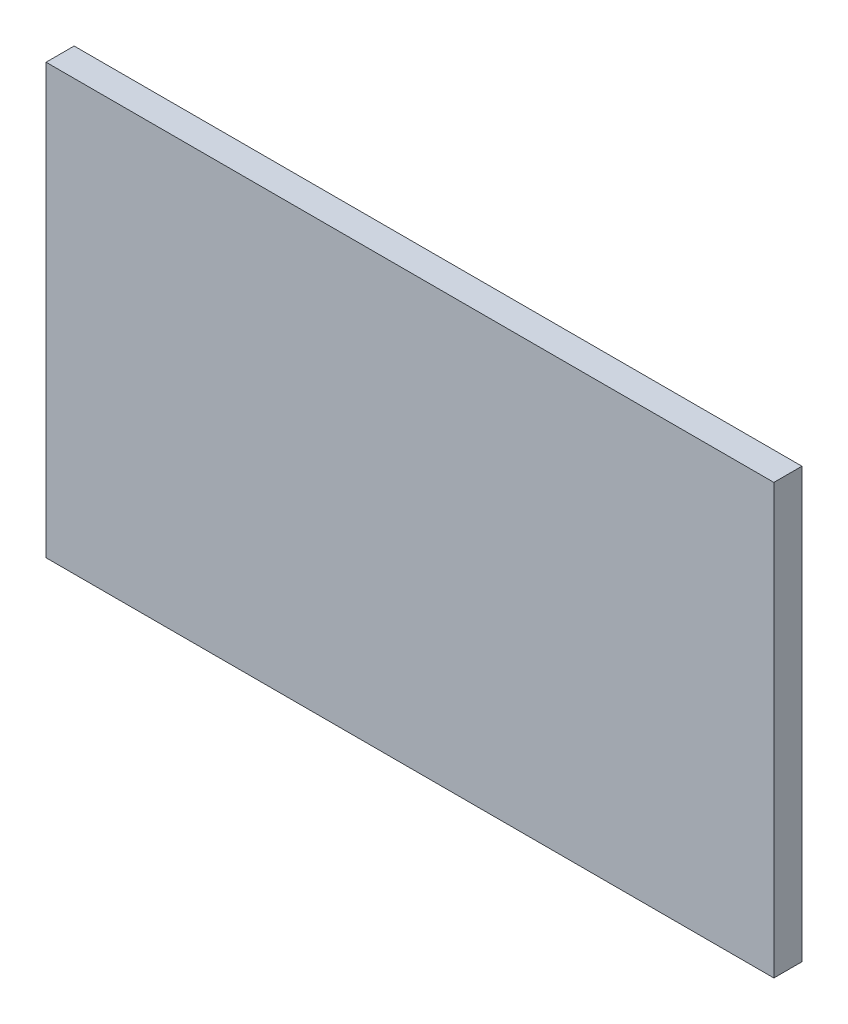
ISO-10303-21;
HEADER;
FILE_DESCRIPTION(('STEP AP214'),'2;1');
FILE_NAME('part.step','',(''),(''),'','','');
FILE_SCHEMA(('AUTOMOTIVE_DESIGN { 1 0 10303 214 1 1 1 1 }'));
ENDSEC;
DATA;
#1=APPLICATION_CONTEXT('core data for automotive mechanical design processes');
#2=APPLICATION_PROTOCOL_DEFINITION('international standard','automotive_design',2000,#1);
#3=PRODUCT_CONTEXT('',#1,'mechanical');
#4=PRODUCT('Part','Part','',(#3));
#5=PRODUCT_RELATED_PRODUCT_CATEGORY('part','',(#4));
#6=PRODUCT_DEFINITION_FORMATION('','',#4);
#7=PRODUCT_DEFINITION_CONTEXT('part definition',#1,'design');
#8=PRODUCT_DEFINITION('design','',#6,#7);
#9=PRODUCT_DEFINITION_SHAPE('','',#8);
#10=(LENGTH_UNIT() NAMED_UNIT(*) SI_UNIT(.MILLI.,.METRE.));
#11=(NAMED_UNIT(*) PLANE_ANGLE_UNIT() SI_UNIT($,.RADIAN.));
#12=(NAMED_UNIT(*) SI_UNIT($,.STERADIAN.) SOLID_ANGLE_UNIT());
#13=UNCERTAINTY_MEASURE_WITH_UNIT(LENGTH_MEASURE(1.E-05),#10,'distance_accuracy_value','');
#14=(GEOMETRIC_REPRESENTATION_CONTEXT(3) GLOBAL_UNCERTAINTY_ASSIGNED_CONTEXT((#13)) GLOBAL_UNIT_ASSIGNED_CONTEXT((#10,
#11,#12)) REPRESENTATION_CONTEXT('',''));
#15=CARTESIAN_POINT('',(0.,0.,0.));
#16=DIRECTION('',(0.,0.,1.));
#17=DIRECTION('',(1.,0.,0.));
#18=AXIS2_PLACEMENT_3D('',#15,#16,#17);
#19=CARTESIAN_POINT('',(17.145,31.115,2.16));
#20=DIRECTION('',(0.,0.,-1.));
#21=DIRECTION('',(-1.,0.,0.));
#22=AXIS2_PLACEMENT_3D('',#19,#20,#21);
#23=PLANE('',#22);
#24=DIRECTION('',(0.,1.,0.));
#25=VECTOR('',#24,1.);
#26=CARTESIAN_POINT('',(-32.385,31.115,2.16));
#27=LINE('',#26,#25);
#28=CARTESIAN_POINT('',(-32.385,31.115,2.16));
#29=VERTEX_POINT('',#28);
#30=CARTESIAN_POINT('',(-32.385,1.905,2.16));
#31=VERTEX_POINT('',#30);
#32=EDGE_CURVE('E55',#29,#31,#27,.F.);
#33=ORIENTED_EDGE('',*,*,#32,.T.);
#34=DIRECTION('',(1.,0.,0.));
#35=VECTOR('',#34,1.);
#36=CARTESIAN_POINT('',(-32.385,1.905,2.16));
#37=LINE('',#36,#35);
#38=CARTESIAN_POINT('',(17.145,1.905,2.16));
#39=VERTEX_POINT('',#38);
#40=EDGE_CURVE('E57',#31,#39,#37,.T.);
#41=ORIENTED_EDGE('',*,*,#40,.T.);
#42=DIRECTION('',(0.,1.,0.));
#43=VECTOR('',#42,1.);
#44=CARTESIAN_POINT('',(17.145,1.905,2.16));
#45=LINE('',#44,#43);
#46=CARTESIAN_POINT('',(17.145,31.115,2.16));
#47=VERTEX_POINT('',#46);
#48=EDGE_CURVE('E20',#39,#47,#45,.T.);
#49=ORIENTED_EDGE('',*,*,#48,.T.);
#50=DIRECTION('',(1.,0.,0.));
#51=VECTOR('',#50,1.);
#52=CARTESIAN_POINT('',(17.145,31.115,2.16));
#53=LINE('',#52,#51);
#54=EDGE_CURVE('E80',#47,#29,#53,.F.);
#55=ORIENTED_EDGE('',*,*,#54,.T.);
#56=EDGE_LOOP('',(#33,#41,#49,#55));
#57=FACE_BOUND('',#56,.T.);
#58=ADVANCED_FACE('F17',(#57),#23,.F.);
#59=CARTESIAN_POINT('',(17.145,1.905,0.25));
#60=DIRECTION('',(-1.,0.,0.));
#61=DIRECTION('',(0.,0.,1.));
#62=AXIS2_PLACEMENT_3D('',#59,#60,#61);
#63=PLANE('',#62);
#64=DIRECTION('',(0.,0.,-1.));
#65=VECTOR('',#64,1.);
#66=CARTESIAN_POINT('',(17.145,31.115,0.25));
#67=LINE('',#66,#65);
#68=CARTESIAN_POINT('',(17.145,31.115,0.25));
#69=VERTEX_POINT('',#68);
#70=EDGE_CURVE('E68',#69,#47,#67,.F.);
#71=ORIENTED_EDGE('',*,*,#70,.T.);
#72=ORIENTED_EDGE('',*,*,#48,.F.);
#73=DIRECTION('',(0.,0.,1.));
#74=VECTOR('',#73,1.);
#75=CARTESIAN_POINT('',(17.145,1.905,0.25));
#76=LINE('',#75,#74);
#77=CARTESIAN_POINT('',(17.145,1.905,0.25));
#78=VERTEX_POINT('',#77);
#79=EDGE_CURVE('E63',#39,#78,#76,.F.);
#80=ORIENTED_EDGE('',*,*,#79,.T.);
#81=DIRECTION('',(0.,1.,0.));
#82=VECTOR('',#81,1.);
#83=CARTESIAN_POINT('',(17.145,31.115,0.25));
#84=LINE('',#83,#82);
#85=EDGE_CURVE('E83',#69,#78,#84,.F.);
#86=ORIENTED_EDGE('',*,*,#85,.F.);
#87=EDGE_LOOP('',(#71,#72,#80,#86));
#88=FACE_BOUND('',#87,.T.);
#89=ADVANCED_FACE('F65',(#88),#63,.F.);
#90=CARTESIAN_POINT('',(-32.385,1.905,0.25));
#91=DIRECTION('',(0.,1.,0.));
#92=DIRECTION('',(0.,0.,1.));
#93=AXIS2_PLACEMENT_3D('',#90,#91,#92);
#94=PLANE('',#93);
#95=ORIENTED_EDGE('',*,*,#79,.F.);
#96=ORIENTED_EDGE('',*,*,#40,.F.);
#97=DIRECTION('',(0.,0.,-1.));
#98=VECTOR('',#97,1.);
#99=CARTESIAN_POINT('',(-32.385,1.905,0.25));
#100=LINE('',#99,#98);
#101=CARTESIAN_POINT('',(-32.385,1.905,0.25));
#102=VERTEX_POINT('',#101);
#103=EDGE_CURVE('E75',#31,#102,#100,.T.);
#104=ORIENTED_EDGE('',*,*,#103,.T.);
#105=DIRECTION('',(-1.,0.,0.));
#106=VECTOR('',#105,1.);
#107=CARTESIAN_POINT('',(17.145,1.905,0.25));
#108=LINE('',#107,#106);
#109=EDGE_CURVE('E72',#78,#102,#108,.T.);
#110=ORIENTED_EDGE('',*,*,#109,.F.);
#111=EDGE_LOOP('',(#95,#96,#104,#110));
#112=FACE_BOUND('',#111,.T.);
#113=ADVANCED_FACE('F70',(#112),#94,.F.);
#114=CARTESIAN_POINT('',(-32.385,31.115,0.25));
#115=DIRECTION('',(1.,0.,0.));
#116=DIRECTION('',(0.,0.,-1.));
#117=AXIS2_PLACEMENT_3D('',#114,#115,#116);
#118=PLANE('',#117);
#119=ORIENTED_EDGE('',*,*,#103,.F.);
#120=ORIENTED_EDGE('',*,*,#32,.F.);
#121=DIRECTION('',(0.,0.,-1.));
#122=VECTOR('',#121,1.);
#123=CARTESIAN_POINT('',(-32.385,31.115,0.25));
#124=LINE('',#123,#122);
#125=CARTESIAN_POINT('',(-32.385,31.115,0.25));
#126=VERTEX_POINT('',#125);
#127=EDGE_CURVE('E35',#29,#126,#124,.T.);
#128=ORIENTED_EDGE('',*,*,#127,.T.);
#129=DIRECTION('',(0.,1.,0.));
#130=VECTOR('',#129,1.);
#131=CARTESIAN_POINT('',(-32.385,31.115,0.25));
#132=LINE('',#131,#130);
#133=EDGE_CURVE('E26',#102,#126,#132,.T.);
#134=ORIENTED_EDGE('',*,*,#133,.F.);
#135=EDGE_LOOP('',(#119,#120,#128,#134));
#136=FACE_BOUND('',#135,.T.);
#137=ADVANCED_FACE('F89',(#136),#118,.F.);
#138=CARTESIAN_POINT('',(17.145,31.115,0.25));
#139=DIRECTION('',(0.,-1.,0.));
#140=DIRECTION('',(0.,0.,-1.));
#141=AXIS2_PLACEMENT_3D('',#138,#139,#140);
#142=PLANE('',#141);
#143=ORIENTED_EDGE('',*,*,#127,.F.);
#144=ORIENTED_EDGE('',*,*,#54,.F.);
#145=ORIENTED_EDGE('',*,*,#70,.F.);
#146=DIRECTION('',(-1.,0.,0.));
#147=VECTOR('',#146,1.);
#148=CARTESIAN_POINT('',(17.145,31.115,0.25));
#149=LINE('',#148,#147);
#150=EDGE_CURVE('E11',#126,#69,#149,.F.);
#151=ORIENTED_EDGE('',*,*,#150,.F.);
#152=EDGE_LOOP('',(#143,#144,#145,#151));
#153=FACE_BOUND('',#152,.T.);
#154=ADVANCED_FACE('F91',(#153),#142,.F.);
#155=CARTESIAN_POINT('',(17.145,31.115,0.25));
#156=DIRECTION('',(0.,0.,-1.));
#157=DIRECTION('',(-1.,0.,0.));
#158=AXIS2_PLACEMENT_3D('',#155,#156,#157);
#159=PLANE('',#158);
#160=ORIENTED_EDGE('',*,*,#133,.T.);
#161=ORIENTED_EDGE('',*,*,#150,.T.);
#162=ORIENTED_EDGE('',*,*,#85,.T.);
#163=ORIENTED_EDGE('',*,*,#109,.T.);
#164=EDGE_LOOP('',(#160,#161,#162,#163));
#165=FACE_BOUND('',#164,.T.);
#166=ADVANCED_FACE('F88',(#165),#159,.T.);
#167=CLOSED_SHELL('',(#58,#89,#113,#137,#154,#166));
#168=MANIFOLD_SOLID_BREP('B1',#167);
#169=ADVANCED_BREP_SHAPE_REPRESENTATION('',(#18,#168),#14);
#170=SHAPE_DEFINITION_REPRESENTATION(#9,#169);
ENDSEC;
END-ISO-10303-21;
